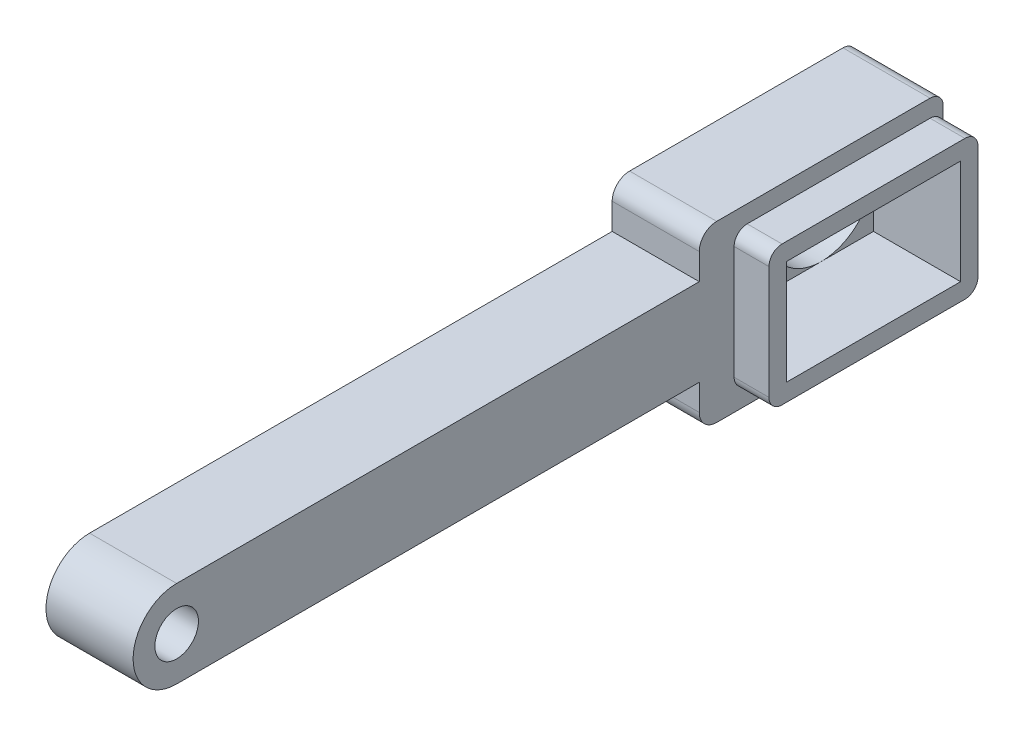
ISO-10303-21;
HEADER;
FILE_DESCRIPTION(('STEP AP214'),'2;1');
FILE_NAME('part.step','',(''),(''),'','','');
FILE_SCHEMA(('AUTOMOTIVE_DESIGN { 1 0 10303 214 1 1 1 1 }'));
ENDSEC;
DATA;
#1=APPLICATION_CONTEXT('core data for automotive mechanical design processes');
#2=APPLICATION_PROTOCOL_DEFINITION('international standard','automotive_design',2000,#1);
#3=PRODUCT_CONTEXT('',#1,'mechanical');
#4=PRODUCT('Part','Part','',(#3));
#5=PRODUCT_RELATED_PRODUCT_CATEGORY('part','',(#4));
#6=PRODUCT_DEFINITION_FORMATION('','',#4);
#7=PRODUCT_DEFINITION_CONTEXT('part definition',#1,'design');
#8=PRODUCT_DEFINITION('design','',#6,#7);
#9=PRODUCT_DEFINITION_SHAPE('','',#8);
#10=(LENGTH_UNIT() NAMED_UNIT(*) SI_UNIT(.MILLI.,.METRE.));
#11=(NAMED_UNIT(*) PLANE_ANGLE_UNIT() SI_UNIT($,.RADIAN.));
#12=(NAMED_UNIT(*) SI_UNIT($,.STERADIAN.) SOLID_ANGLE_UNIT());
#13=UNCERTAINTY_MEASURE_WITH_UNIT(LENGTH_MEASURE(1.E-05),#10,'distance_accuracy_value','');
#14=(GEOMETRIC_REPRESENTATION_CONTEXT(3) GLOBAL_UNCERTAINTY_ASSIGNED_CONTEXT((#13)) GLOBAL_UNIT_ASSIGNED_CONTEXT((#10,
#11,#12)) REPRESENTATION_CONTEXT('',''));
#15=CARTESIAN_POINT('',(0.,0.,0.));
#16=DIRECTION('',(0.,0.,1.));
#17=DIRECTION('',(1.,0.,0.));
#18=AXIS2_PLACEMENT_3D('',#15,#16,#17);
#19=CARTESIAN_POINT('',(10.,-8.,-22.));
#20=DIRECTION('',(-1.,0.,0.));
#21=DIRECTION('',(0.,0.,1.));
#22=AXIS2_PLACEMENT_3D('',#19,#20,#21);
#23=PLANE('',#22);
#24=CARTESIAN_POINT('',(10.,6.5,-46.5));
#25=DIRECTION('',(1.,0.,0.));
#26=DIRECTION('',(0.,0.,-1.));
#27=AXIS2_PLACEMENT_3D('',#24,#25,#26);
#28=CIRCLE('',#27,1.5);
#29=CARTESIAN_POINT('',(10.,6.5,-48.));
#30=VERTEX_POINT('',#29);
#31=CARTESIAN_POINT('',(10.,8.,-46.5));
#32=VERTEX_POINT('',#31);
#33=EDGE_CURVE('E279',#30,#32,#28,.T.);
#34=ORIENTED_EDGE('',*,*,#33,.F.);
#35=DIRECTION('',(0.,1.,0.));
#36=VECTOR('',#35,1.);
#37=CARTESIAN_POINT('',(10.,8.49999999999999,-48.));
#38=LINE('',#37,#36);
#39=CARTESIAN_POINT('',(10.,8.49999999999999,-48.));
#40=VERTEX_POINT('',#39);
#41=EDGE_CURVE('E350',#30,#40,#38,.T.);
#42=ORIENTED_EDGE('',*,*,#41,.T.);
#43=CARTESIAN_POINT('',(10.,8.49999999999999,-46.5));
#44=DIRECTION('',(1.,0.,0.));
#45=DIRECTION('',(0.,0.,1.));
#46=AXIS2_PLACEMENT_3D('',#43,#44,#45);
#47=CIRCLE('',#46,1.5);
#48=CARTESIAN_POINT('',(10.,10.,-46.5));
#49=VERTEX_POINT('',#48);
#50=EDGE_CURVE('E353',#40,#49,#47,.T.);
#51=ORIENTED_EDGE('',*,*,#50,.T.);
#52=DIRECTION('',(0.,0.,1.));
#53=VECTOR('',#52,1.);
#54=CARTESIAN_POINT('',(10.,10.,-40.));
#55=LINE('',#54,#53);
#56=CARTESIAN_POINT('',(10.,10.,-22.));
#57=VERTEX_POINT('',#56);
#58=EDGE_CURVE('E355',#49,#57,#55,.T.);
#59=ORIENTED_EDGE('',*,*,#58,.T.);
#60=CARTESIAN_POINT('',(10.,8.,-22.));
#61=DIRECTION('',(1.,0.,0.));
#62=DIRECTION('',(0.,0.,1.));
#63=AXIS2_PLACEMENT_3D('',#60,#61,#62);
#64=CIRCLE('',#63,2.);
#65=CARTESIAN_POINT('',(10.,8.,-20.));
#66=VERTEX_POINT('',#65);
#67=EDGE_CURVE('E357',#57,#66,#64,.T.);
#68=ORIENTED_EDGE('',*,*,#67,.T.);
#69=DIRECTION('',(0.,-1.,0.));
#70=VECTOR('',#69,1.);
#71=CARTESIAN_POINT('',(10.,5.,-20.));
#72=LINE('',#71,#70);
#73=CARTESIAN_POINT('',(10.,5.,-20.));
#74=VERTEX_POINT('',#73);
#75=EDGE_CURVE('E359',#66,#74,#72,.T.);
#76=ORIENTED_EDGE('',*,*,#75,.T.);
#77=DIRECTION('',(0.,0.,1.));
#78=VECTOR('',#77,1.);
#79=CARTESIAN_POINT('',(10.,5.,0.));
#80=LINE('',#79,#78);
#81=CARTESIAN_POINT('',(10.,4.99999999999999,40.));
#82=VERTEX_POINT('',#81);
#83=EDGE_CURVE('E361',#74,#82,#80,.T.);
#84=ORIENTED_EDGE('',*,*,#83,.T.);
#85=CARTESIAN_POINT('',(10.,0.,40.));
#86=DIRECTION('',(1.,0.,0.));
#87=DIRECTION('',(0.,0.,-1.));
#88=AXIS2_PLACEMENT_3D('',#85,#86,#87);
#89=CIRCLE('',#88,4.99999999999999);
#90=CARTESIAN_POINT('',(10.,-4.99999999999999,40.));
#91=VERTEX_POINT('',#90);
#92=EDGE_CURVE('E363',#82,#91,#89,.T.);
#93=ORIENTED_EDGE('',*,*,#92,.T.);
#94=DIRECTION('',(0.,0.,-1.));
#95=VECTOR('',#94,1.);
#96=CARTESIAN_POINT('',(10.,-5.,0.));
#97=LINE('',#96,#95);
#98=CARTESIAN_POINT('',(10.,-5.,-20.));
#99=VERTEX_POINT('',#98);
#100=EDGE_CURVE('E365',#91,#99,#97,.T.);
#101=ORIENTED_EDGE('',*,*,#100,.T.);
#102=DIRECTION('',(0.,-1.,0.));
#103=VECTOR('',#102,1.);
#104=CARTESIAN_POINT('',(10.,-5.,-20.));
#105=LINE('',#104,#103);
#106=CARTESIAN_POINT('',(10.,-8.,-20.));
#107=VERTEX_POINT('',#106);
#108=EDGE_CURVE('E367',#99,#107,#105,.T.);
#109=ORIENTED_EDGE('',*,*,#108,.T.);
#110=CARTESIAN_POINT('',(10.,-8.,-22.));
#111=DIRECTION('',(1.,0.,0.));
#112=DIRECTION('',(0.,0.,1.));
#113=AXIS2_PLACEMENT_3D('',#110,#111,#112);
#114=CIRCLE('',#113,2.);
#115=CARTESIAN_POINT('',(10.,-10.,-22.));
#116=VERTEX_POINT('',#115);
#117=EDGE_CURVE('E369',#107,#116,#114,.T.);
#118=ORIENTED_EDGE('',*,*,#117,.T.);
#119=DIRECTION('',(0.,0.,-1.));
#120=VECTOR('',#119,1.);
#121=CARTESIAN_POINT('',(10.,-10.,-46.5));
#122=LINE('',#121,#120);
#123=CARTESIAN_POINT('',(10.,-10.,-46.5));
#124=VERTEX_POINT('',#123);
#125=EDGE_CURVE('E344',#116,#124,#122,.T.);
#126=ORIENTED_EDGE('',*,*,#125,.T.);
#127=CARTESIAN_POINT('',(10.,-8.49999999999999,-46.5));
#128=DIRECTION('',(1.,0.,0.));
#129=DIRECTION('',(0.,0.,1.));
#130=AXIS2_PLACEMENT_3D('',#127,#128,#129);
#131=CIRCLE('',#130,1.5);
#132=CARTESIAN_POINT('',(10.,-8.49999999999999,-48.));
#133=VERTEX_POINT('',#132);
#134=EDGE_CURVE('E347',#124,#133,#131,.T.);
#135=ORIENTED_EDGE('',*,*,#134,.T.);
#136=CARTESIAN_POINT('',(10.,-6.5,-48.));
#137=VERTEX_POINT('',#136);
#138=EDGE_CURVE('E351',#133,#137,#38,.T.);
#139=ORIENTED_EDGE('',*,*,#138,.T.);
#140=CARTESIAN_POINT('',(10.,-6.5,-46.5));
#141=DIRECTION('',(1.,0.,0.));
#142=DIRECTION('',(0.,0.,-1.));
#143=AXIS2_PLACEMENT_3D('',#140,#141,#142);
#144=CIRCLE('',#143,1.5);
#145=CARTESIAN_POINT('',(10.,-8.,-46.5));
#146=VERTEX_POINT('',#145);
#147=EDGE_CURVE('E276',#146,#137,#144,.T.);
#148=ORIENTED_EDGE('',*,*,#147,.F.);
#149=DIRECTION('',(0.,0.,-1.));
#150=VECTOR('',#149,1.);
#151=CARTESIAN_POINT('',(10.,-8.,0.));
#152=LINE('',#151,#150);
#153=CARTESIAN_POINT('',(10.,-8.,-25.5));
#154=VERTEX_POINT('',#153);
#155=EDGE_CURVE('E273',#154,#146,#152,.T.);
#156=ORIENTED_EDGE('',*,*,#155,.F.);
#157=CARTESIAN_POINT('',(10.,-6.5,-25.5));
#158=DIRECTION('',(1.,0.,0.));
#159=DIRECTION('',(0.,0.,-1.));
#160=AXIS2_PLACEMENT_3D('',#157,#158,#159);
#161=CIRCLE('',#160,1.5);
#162=CARTESIAN_POINT('',(10.,-6.49999999999999,-24.));
#163=VERTEX_POINT('',#162);
#164=EDGE_CURVE('E270',#163,#154,#161,.T.);
#165=ORIENTED_EDGE('',*,*,#164,.F.);
#166=DIRECTION('',(0.,-1.,0.));
#167=VECTOR('',#166,1.);
#168=CARTESIAN_POINT('',(10.,0.,-24.));
#169=LINE('',#168,#167);
#170=CARTESIAN_POINT('',(10.,6.49999999999999,-24.));
#171=VERTEX_POINT('',#170);
#172=EDGE_CURVE('E267',#171,#163,#169,.T.);
#173=ORIENTED_EDGE('',*,*,#172,.F.);
#174=CARTESIAN_POINT('',(10.,6.5,-25.5));
#175=DIRECTION('',(1.,0.,0.));
#176=DIRECTION('',(0.,0.,-1.));
#177=AXIS2_PLACEMENT_3D('',#174,#175,#176);
#178=CIRCLE('',#177,1.5);
#179=CARTESIAN_POINT('',(10.,8.,-25.5));
#180=VERTEX_POINT('',#179);
#181=EDGE_CURVE('E56',#180,#171,#178,.T.);
#182=ORIENTED_EDGE('',*,*,#181,.F.);
#183=DIRECTION('',(0.,0.,1.));
#184=VECTOR('',#183,1.);
#185=CARTESIAN_POINT('',(10.,8.,0.));
#186=LINE('',#185,#184);
#187=EDGE_CURVE('E51',#32,#180,#186,.T.);
#188=ORIENTED_EDGE('',*,*,#187,.F.);
#189=EDGE_LOOP('',(#34,#42,#51,#59,#68,#76,#84,#93,#101,#109,#118,#126,#135,#139,#148,#156,#165,
#173,#182,#188));
#190=FACE_BOUND('',#189,.T.);
#191=CARTESIAN_POINT('',(10.,0.,40.));
#192=DIRECTION('',(1.,0.,0.));
#193=DIRECTION('',(0.,0.,-1.));
#194=AXIS2_PLACEMENT_3D('',#191,#192,#193);
#195=CIRCLE('',#194,2.5);
#196=CARTESIAN_POINT('',(10.,0.,37.5));
#197=VERTEX_POINT('',#196);
#198=EDGE_CURVE('E337',#197,#197,#195,.T.);
#199=ORIENTED_EDGE('',*,*,#198,.F.);
#200=EDGE_LOOP('',(#199));
#201=FACE_BOUND('',#200,.T.);
#202=ADVANCED_FACE('F36',(#190,#201),#23,.F.);
#203=CARTESIAN_POINT('',(0.,-8.,-22.));
#204=DIRECTION('',(-1.,0.,0.));
#205=DIRECTION('',(0.,0.,1.));
#206=AXIS2_PLACEMENT_3D('',#203,#204,#205);
#207=PLANE('',#206);
#208=CARTESIAN_POINT('',(0.,-8.49999999999999,-46.5));
#209=DIRECTION('',(1.,0.,0.));
#210=DIRECTION('',(0.,0.,1.));
#211=AXIS2_PLACEMENT_3D('',#208,#209,#210);
#212=CIRCLE('',#211,1.5);
#213=CARTESIAN_POINT('',(0.,-10.,-46.5));
#214=VERTEX_POINT('',#213);
#215=CARTESIAN_POINT('',(0.,-8.49999999999999,-48.));
#216=VERTEX_POINT('',#215);
#217=EDGE_CURVE('E341',#214,#216,#212,.T.);
#218=ORIENTED_EDGE('',*,*,#217,.F.);
#219=DIRECTION('',(0.,0.,-1.));
#220=VECTOR('',#219,1.);
#221=CARTESIAN_POINT('',(0.,-10.,-22.));
#222=LINE('',#221,#220);
#223=CARTESIAN_POINT('',(0.,-10.,-22.));
#224=VERTEX_POINT('',#223);
#225=EDGE_CURVE('E348',#224,#214,#222,.T.);
#226=ORIENTED_EDGE('',*,*,#225,.F.);
#227=CARTESIAN_POINT('',(0.,-8.,-22.));
#228=DIRECTION('',(1.,0.,0.));
#229=DIRECTION('',(0.,0.,1.));
#230=AXIS2_PLACEMENT_3D('',#227,#228,#229);
#231=CIRCLE('',#230,2.);
#232=CARTESIAN_POINT('',(0.,-8.,-20.));
#233=VERTEX_POINT('',#232);
#234=EDGE_CURVE('E395',#233,#224,#231,.T.);
#235=ORIENTED_EDGE('',*,*,#234,.F.);
#236=DIRECTION('',(0.,-1.,0.));
#237=VECTOR('',#236,1.);
#238=CARTESIAN_POINT('',(0.,-5.,-20.));
#239=LINE('',#238,#237);
#240=CARTESIAN_POINT('',(0.,-5.,-20.));
#241=VERTEX_POINT('',#240);
#242=EDGE_CURVE('E393',#241,#233,#239,.T.);
#243=ORIENTED_EDGE('',*,*,#242,.F.);
#244=DIRECTION('',(0.,0.,-1.));
#245=VECTOR('',#244,1.);
#246=CARTESIAN_POINT('',(0.,-5.,0.));
#247=LINE('',#246,#245);
#248=CARTESIAN_POINT('',(0.,-4.99999999999999,40.));
#249=VERTEX_POINT('',#248);
#250=EDGE_CURVE('E391',#249,#241,#247,.T.);
#251=ORIENTED_EDGE('',*,*,#250,.F.);
#252=CARTESIAN_POINT('',(0.,0.,40.));
#253=DIRECTION('',(1.,0.,0.));
#254=DIRECTION('',(0.,0.,-1.));
#255=AXIS2_PLACEMENT_3D('',#252,#253,#254);
#256=CIRCLE('',#255,4.99999999999999);
#257=CARTESIAN_POINT('',(0.,4.99999999999999,40.));
#258=VERTEX_POINT('',#257);
#259=EDGE_CURVE('E388',#258,#249,#256,.T.);
#260=ORIENTED_EDGE('',*,*,#259,.F.);
#261=DIRECTION('',(0.,0.,1.));
#262=VECTOR('',#261,1.);
#263=CARTESIAN_POINT('',(0.,5.,0.));
#264=LINE('',#263,#262);
#265=CARTESIAN_POINT('',(0.,5.,-20.));
#266=VERTEX_POINT('',#265);
#267=EDGE_CURVE('E386',#266,#258,#264,.T.);
#268=ORIENTED_EDGE('',*,*,#267,.F.);
#269=DIRECTION('',(0.,-1.,0.));
#270=VECTOR('',#269,1.);
#271=CARTESIAN_POINT('',(0.,5.,-20.));
#272=LINE('',#271,#270);
#273=CARTESIAN_POINT('',(0.,8.,-20.));
#274=VERTEX_POINT('',#273);
#275=EDGE_CURVE('E383',#274,#266,#272,.T.);
#276=ORIENTED_EDGE('',*,*,#275,.F.);
#277=CARTESIAN_POINT('',(0.,8.,-22.));
#278=DIRECTION('',(1.,0.,0.));
#279=DIRECTION('',(0.,0.,1.));
#280=AXIS2_PLACEMENT_3D('',#277,#278,#279);
#281=CIRCLE('',#280,2.);
#282=CARTESIAN_POINT('',(0.,10.,-22.));
#283=VERTEX_POINT('',#282);
#284=EDGE_CURVE('E381',#283,#274,#281,.T.);
#285=ORIENTED_EDGE('',*,*,#284,.F.);
#286=DIRECTION('',(0.,0.,1.));
#287=VECTOR('',#286,1.);
#288=CARTESIAN_POINT('',(0.,10.,-22.));
#289=LINE('',#288,#287);
#290=CARTESIAN_POINT('',(0.,10.,-46.5));
#291=VERTEX_POINT('',#290);
#292=EDGE_CURVE('E379',#291,#283,#289,.T.);
#293=ORIENTED_EDGE('',*,*,#292,.F.);
#294=CARTESIAN_POINT('',(0.,8.49999999999999,-46.5));
#295=DIRECTION('',(1.,0.,0.));
#296=DIRECTION('',(0.,0.,1.));
#297=AXIS2_PLACEMENT_3D('',#294,#295,#296);
#298=CIRCLE('',#297,1.5);
#299=CARTESIAN_POINT('',(0.,8.49999999999999,-48.));
#300=VERTEX_POINT('',#299);
#301=EDGE_CURVE('E376',#300,#291,#298,.T.);
#302=ORIENTED_EDGE('',*,*,#301,.F.);
#303=DIRECTION('',(0.,1.,0.));
#304=VECTOR('',#303,1.);
#305=CARTESIAN_POINT('',(0.,8.49999999999999,-48.));
#306=LINE('',#305,#304);
#307=EDGE_CURVE('E374',#216,#300,#306,.T.);
#308=ORIENTED_EDGE('',*,*,#307,.F.);
#309=EDGE_LOOP('',(#218,#226,#235,#243,#251,#260,#268,#276,#285,#293,#302,#308));
#310=FACE_BOUND('',#309,.T.);
#311=CARTESIAN_POINT('',(0.,0.,-34.));
#312=DIRECTION('',(1.,0.,0.));
#313=DIRECTION('',(0.,0.,-1.));
#314=AXIS2_PLACEMENT_3D('',#311,#312,#313);
#315=CIRCLE('',#314,4.);
#316=CARTESIAN_POINT('',(0.,3.77123616632825,-35.3333333333333));
#317=VERTEX_POINT('',#316);
#318=CARTESIAN_POINT('',(0.,-3.77123616632825,-35.3333333333333));
#319=VERTEX_POINT('',#318);
#320=EDGE_CURVE('E328',#317,#319,#315,.T.);
#321=ORIENTED_EDGE('',*,*,#320,.T.);
#322=CARTESIAN_POINT('',(0.,0.,-40.));
#323=DIRECTION('',(-1.,0.,0.));
#324=DIRECTION('',(0.,0.,1.));
#325=AXIS2_PLACEMENT_3D('',#322,#323,#324);
#326=CIRCLE('',#325,6.);
#327=EDGE_CURVE('E325',#317,#319,#326,.T.);
#328=ORIENTED_EDGE('',*,*,#327,.F.);
#329=EDGE_LOOP('',(#321,#328));
#330=FACE_BOUND('',#329,.T.);
#331=ADVANCED_FACE('F441',(#310,#330),#207,.T.);
#332=CARTESIAN_POINT('',(10.,-8.49999999999999,-46.5));
#333=DIRECTION('',(-1.,0.,0.));
#334=DIRECTION('',(0.,0.,1.));
#335=AXIS2_PLACEMENT_3D('',#332,#333,#334);
#336=CYLINDRICAL_SURFACE('',#335,1.5);
#337=ORIENTED_EDGE('',*,*,#217,.T.);
#338=DIRECTION('',(-1.,0.,0.));
#339=VECTOR('',#338,1.);
#340=CARTESIAN_POINT('',(10.,-8.49999999999999,-48.));
#341=LINE('',#340,#339);
#342=EDGE_CURVE('E427',#133,#216,#341,.T.);
#343=ORIENTED_EDGE('',*,*,#342,.F.);
#344=ORIENTED_EDGE('',*,*,#134,.F.);
#345=DIRECTION('',(-1.,0.,0.));
#346=VECTOR('',#345,1.);
#347=CARTESIAN_POINT('',(10.,-10.,-46.5));
#348=LINE('',#347,#346);
#349=EDGE_CURVE('E44',#124,#214,#348,.T.);
#350=ORIENTED_EDGE('',*,*,#349,.T.);
#351=EDGE_LOOP('',(#337,#343,#344,#350));
#352=FACE_BOUND('',#351,.T.);
#353=ADVANCED_FACE('F38',(#352),#336,.T.);
#354=CARTESIAN_POINT('',(10.,8.49999999999999,-48.));
#355=DIRECTION('',(0.,0.,1.));
#356=DIRECTION('',(1.,0.,0.));
#357=AXIS2_PLACEMENT_3D('',#354,#355,#356);
#358=PLANE('',#357);
#359=ORIENTED_EDGE('',*,*,#307,.T.);
#360=DIRECTION('',(-1.,0.,0.));
#361=VECTOR('',#360,1.);
#362=CARTESIAN_POINT('',(10.,8.49999999999999,-48.));
#363=LINE('',#362,#361);
#364=EDGE_CURVE('E424',#40,#300,#363,.T.);
#365=ORIENTED_EDGE('',*,*,#364,.F.);
#366=ORIENTED_EDGE('',*,*,#41,.F.);
#367=DIRECTION('',(-1.,0.,0.));
#368=VECTOR('',#367,1.);
#369=CARTESIAN_POINT('',(14.,6.49999999999999,-48.));
#370=LINE('',#369,#368);
#371=CARTESIAN_POINT('',(14.,6.49999999999999,-48.));
#372=VERTEX_POINT('',#371);
#373=EDGE_CURVE('E290',#372,#30,#370,.T.);
#374=ORIENTED_EDGE('',*,*,#373,.F.);
#375=DIRECTION('',(0.,1.,0.));
#376=VECTOR('',#375,1.);
#377=CARTESIAN_POINT('',(14.,0.,-48.));
#378=LINE('',#377,#376);
#379=CARTESIAN_POINT('',(14.,-6.49999999999999,-48.));
#380=VERTEX_POINT('',#379);
#381=EDGE_CURVE('E258',#380,#372,#378,.T.);
#382=ORIENTED_EDGE('',*,*,#381,.F.);
#383=DIRECTION('',(-1.,0.,0.));
#384=VECTOR('',#383,1.);
#385=CARTESIAN_POINT('',(14.,-6.49999999999999,-48.));
#386=LINE('',#385,#384);
#387=EDGE_CURVE('E293',#380,#137,#386,.T.);
#388=ORIENTED_EDGE('',*,*,#387,.T.);
#389=ORIENTED_EDGE('',*,*,#138,.F.);
#390=ORIENTED_EDGE('',*,*,#342,.T.);
#391=EDGE_LOOP('',(#359,#365,#366,#374,#382,#388,#389,#390));
#392=FACE_BOUND('',#391,.T.);
#393=ADVANCED_FACE('F446',(#392),#358,.F.);
#394=CARTESIAN_POINT('',(10.,8.49999999999999,-46.5));
#395=DIRECTION('',(-1.,0.,0.));
#396=DIRECTION('',(0.,0.,1.));
#397=AXIS2_PLACEMENT_3D('',#394,#395,#396);
#398=CYLINDRICAL_SURFACE('',#397,1.5);
#399=ORIENTED_EDGE('',*,*,#301,.T.);
#400=DIRECTION('',(-1.,0.,0.));
#401=VECTOR('',#400,1.);
#402=CARTESIAN_POINT('',(10.,10.,-46.5));
#403=LINE('',#402,#401);
#404=EDGE_CURVE('E421',#49,#291,#403,.T.);
#405=ORIENTED_EDGE('',*,*,#404,.F.);
#406=ORIENTED_EDGE('',*,*,#50,.F.);
#407=ORIENTED_EDGE('',*,*,#364,.T.);
#408=EDGE_LOOP('',(#399,#405,#406,#407));
#409=FACE_BOUND('',#408,.T.);
#410=ADVANCED_FACE('F451',(#409),#398,.T.);
#411=CARTESIAN_POINT('',(10.,10.,-22.));
#412=DIRECTION('',(0.,-1.,0.));
#413=DIRECTION('',(0.,0.,-1.));
#414=AXIS2_PLACEMENT_3D('',#411,#412,#413);
#415=PLANE('',#414);
#416=ORIENTED_EDGE('',*,*,#292,.T.);
#417=DIRECTION('',(-1.,0.,0.));
#418=VECTOR('',#417,1.);
#419=CARTESIAN_POINT('',(10.,10.,-22.));
#420=LINE('',#419,#418);
#421=EDGE_CURVE('E418',#57,#283,#420,.T.);
#422=ORIENTED_EDGE('',*,*,#421,.F.);
#423=ORIENTED_EDGE('',*,*,#58,.F.);
#424=ORIENTED_EDGE('',*,*,#404,.T.);
#425=EDGE_LOOP('',(#416,#422,#423,#424));
#426=FACE_BOUND('',#425,.T.);
#427=ADVANCED_FACE('F534',(#426),#415,.F.);
#428=CARTESIAN_POINT('',(10.,8.,-22.));
#429=DIRECTION('',(-1.,0.,0.));
#430=DIRECTION('',(0.,0.,1.));
#431=AXIS2_PLACEMENT_3D('',#428,#429,#430);
#432=CYLINDRICAL_SURFACE('',#431,2.);
#433=ORIENTED_EDGE('',*,*,#284,.T.);
#434=DIRECTION('',(-1.,0.,0.));
#435=VECTOR('',#434,1.);
#436=CARTESIAN_POINT('',(10.,8.,-20.));
#437=LINE('',#436,#435);
#438=EDGE_CURVE('E415',#66,#274,#437,.T.);
#439=ORIENTED_EDGE('',*,*,#438,.F.);
#440=ORIENTED_EDGE('',*,*,#67,.F.);
#441=ORIENTED_EDGE('',*,*,#421,.T.);
#442=EDGE_LOOP('',(#433,#439,#440,#441));
#443=FACE_BOUND('',#442,.T.);
#444=ADVANCED_FACE('F530',(#443),#432,.T.);
#445=CARTESIAN_POINT('',(10.,5.,-20.));
#446=DIRECTION('',(0.,0.,-1.));
#447=DIRECTION('',(-1.,0.,0.));
#448=AXIS2_PLACEMENT_3D('',#445,#446,#447);
#449=PLANE('',#448);
#450=ORIENTED_EDGE('',*,*,#275,.T.);
#451=DIRECTION('',(-1.,0.,0.));
#452=VECTOR('',#451,1.);
#453=CARTESIAN_POINT('',(10.,5.,-20.));
#454=LINE('',#453,#452);
#455=EDGE_CURVE('E412',#74,#266,#454,.T.);
#456=ORIENTED_EDGE('',*,*,#455,.F.);
#457=ORIENTED_EDGE('',*,*,#75,.F.);
#458=ORIENTED_EDGE('',*,*,#438,.T.);
#459=EDGE_LOOP('',(#450,#456,#457,#458));
#460=FACE_BOUND('',#459,.T.);
#461=ADVANCED_FACE('F526',(#460),#449,.F.);
#462=CARTESIAN_POINT('',(10.,5.,0.));
#463=DIRECTION('',(0.,-1.,0.));
#464=DIRECTION('',(0.,0.,-1.));
#465=AXIS2_PLACEMENT_3D('',#462,#463,#464);
#466=PLANE('',#465);
#467=ORIENTED_EDGE('',*,*,#267,.T.);
#468=DIRECTION('',(-1.,0.,0.));
#469=VECTOR('',#468,1.);
#470=CARTESIAN_POINT('',(10.,4.99999999999999,40.));
#471=LINE('',#470,#469);
#472=EDGE_CURVE('E409',#82,#258,#471,.T.);
#473=ORIENTED_EDGE('',*,*,#472,.F.);
#474=ORIENTED_EDGE('',*,*,#83,.F.);
#475=ORIENTED_EDGE('',*,*,#455,.T.);
#476=EDGE_LOOP('',(#467,#473,#474,#475));
#477=FACE_BOUND('',#476,.T.);
#478=ADVANCED_FACE('F522',(#477),#466,.F.);
#479=CARTESIAN_POINT('',(10.,0.,40.));
#480=DIRECTION('',(-1.,0.,0.));
#481=DIRECTION('',(0.,0.,1.));
#482=AXIS2_PLACEMENT_3D('',#479,#480,#481);
#483=CYLINDRICAL_SURFACE('',#482,4.99999999999999);
#484=ORIENTED_EDGE('',*,*,#259,.T.);
#485=DIRECTION('',(-1.,0.,0.));
#486=VECTOR('',#485,1.);
#487=CARTESIAN_POINT('',(10.,-4.99999999999999,40.));
#488=LINE('',#487,#486);
#489=EDGE_CURVE('E406',#91,#249,#488,.T.);
#490=ORIENTED_EDGE('',*,*,#489,.F.);
#491=ORIENTED_EDGE('',*,*,#92,.F.);
#492=ORIENTED_EDGE('',*,*,#472,.T.);
#493=EDGE_LOOP('',(#484,#490,#491,#492));
#494=FACE_BOUND('',#493,.T.);
#495=ADVANCED_FACE('F518',(#494),#483,.T.);
#496=CARTESIAN_POINT('',(10.,-5.,0.));
#497=DIRECTION('',(0.,1.,0.));
#498=DIRECTION('',(0.,0.,1.));
#499=AXIS2_PLACEMENT_3D('',#496,#497,#498);
#500=PLANE('',#499);
#501=ORIENTED_EDGE('',*,*,#250,.T.);
#502=DIRECTION('',(-1.,0.,0.));
#503=VECTOR('',#502,1.);
#504=CARTESIAN_POINT('',(10.,-5.,-20.));
#505=LINE('',#504,#503);
#506=EDGE_CURVE('E403',#99,#241,#505,.T.);
#507=ORIENTED_EDGE('',*,*,#506,.F.);
#508=ORIENTED_EDGE('',*,*,#100,.F.);
#509=ORIENTED_EDGE('',*,*,#489,.T.);
#510=EDGE_LOOP('',(#501,#507,#508,#509));
#511=FACE_BOUND('',#510,.T.);
#512=ADVANCED_FACE('F514',(#511),#500,.F.);
#513=CARTESIAN_POINT('',(10.,-5.,-20.));
#514=DIRECTION('',(0.,0.,-1.));
#515=DIRECTION('',(-1.,0.,0.));
#516=AXIS2_PLACEMENT_3D('',#513,#514,#515);
#517=PLANE('',#516);
#518=ORIENTED_EDGE('',*,*,#242,.T.);
#519=DIRECTION('',(-1.,0.,0.));
#520=VECTOR('',#519,1.);
#521=CARTESIAN_POINT('',(10.,-8.,-20.));
#522=LINE('',#521,#520);
#523=EDGE_CURVE('E400',#107,#233,#522,.T.);
#524=ORIENTED_EDGE('',*,*,#523,.F.);
#525=ORIENTED_EDGE('',*,*,#108,.F.);
#526=ORIENTED_EDGE('',*,*,#506,.T.);
#527=EDGE_LOOP('',(#518,#524,#525,#526));
#528=FACE_BOUND('',#527,.T.);
#529=ADVANCED_FACE('F510',(#528),#517,.F.);
#530=CARTESIAN_POINT('',(10.,-8.,-22.));
#531=DIRECTION('',(-1.,0.,0.));
#532=DIRECTION('',(0.,0.,1.));
#533=AXIS2_PLACEMENT_3D('',#530,#531,#532);
#534=CYLINDRICAL_SURFACE('',#533,2.);
#535=ORIENTED_EDGE('',*,*,#234,.T.);
#536=DIRECTION('',(-1.,0.,0.));
#537=VECTOR('',#536,1.);
#538=CARTESIAN_POINT('',(10.,-10.,-22.));
#539=LINE('',#538,#537);
#540=EDGE_CURVE('E372',#116,#224,#539,.T.);
#541=ORIENTED_EDGE('',*,*,#540,.F.);
#542=ORIENTED_EDGE('',*,*,#117,.F.);
#543=ORIENTED_EDGE('',*,*,#523,.T.);
#544=EDGE_LOOP('',(#535,#541,#542,#543));
#545=FACE_BOUND('',#544,.T.);
#546=ADVANCED_FACE('F507',(#545),#534,.T.);
#547=CARTESIAN_POINT('',(10.,-10.,-22.));
#548=DIRECTION('',(0.,1.,0.));
#549=DIRECTION('',(0.,0.,1.));
#550=AXIS2_PLACEMENT_3D('',#547,#548,#549);
#551=PLANE('',#550);
#552=ORIENTED_EDGE('',*,*,#225,.T.);
#553=ORIENTED_EDGE('',*,*,#349,.F.);
#554=ORIENTED_EDGE('',*,*,#125,.F.);
#555=ORIENTED_EDGE('',*,*,#540,.T.);
#556=EDGE_LOOP('',(#552,#553,#554,#555));
#557=FACE_BOUND('',#556,.T.);
#558=ADVANCED_FACE('F435',(#557),#551,.F.);
#559=CARTESIAN_POINT('',(5.,0.,40.));
#560=DIRECTION('',(1.,0.,0.));
#561=DIRECTION('',(0.,0.,-1.));
#562=AXIS2_PLACEMENT_3D('',#559,#560,#561);
#563=CYLINDRICAL_SURFACE('',#562,2.5);
#564=CARTESIAN_POINT('',(5.,0.,40.));
#565=DIRECTION('',(1.,0.,0.));
#566=DIRECTION('',(0.,0.,-1.));
#567=AXIS2_PLACEMENT_3D('',#564,#565,#566);
#568=CIRCLE('',#567,2.5);
#569=CARTESIAN_POINT('',(5.,0.,37.5));
#570=VERTEX_POINT('',#569);
#571=EDGE_CURVE('E338',#570,#570,#568,.T.);
#572=ORIENTED_EDGE('',*,*,#571,.F.);
#573=EDGE_LOOP('',(#572));
#574=FACE_BOUND('',#573,.T.);
#575=ORIENTED_EDGE('',*,*,#198,.T.);
#576=EDGE_LOOP('',(#575));
#577=FACE_BOUND('',#576,.T.);
#578=ADVANCED_FACE('F502',(#574,#577),#563,.F.);
#579=CARTESIAN_POINT('',(5.,0.,40.));
#580=DIRECTION('',(1.,0.,0.));
#581=DIRECTION('',(0.,0.,-1.));
#582=AXIS2_PLACEMENT_3D('',#579,#580,#581);
#583=PLANE('',#582);
#584=ORIENTED_EDGE('',*,*,#571,.T.);
#585=EDGE_LOOP('',(#584));
#586=FACE_BOUND('',#585,.T.);
#587=ADVANCED_FACE('F559',(#586),#583,.T.);
#588=CARTESIAN_POINT('',(0.,0.,-40.));
#589=DIRECTION('',(1.,0.,0.));
#590=DIRECTION('',(0.,0.,-1.));
#591=AXIS2_PLACEMENT_3D('',#588,#589,#590);
#592=CYLINDRICAL_SURFACE('',#591,6.);
#593=CARTESIAN_POINT('',(4.,0.,-40.));
#594=DIRECTION('',(-1.,0.,0.));
#595=DIRECTION('',(0.,0.,1.));
#596=AXIS2_PLACEMENT_3D('',#593,#594,#595);
#597=CIRCLE('',#596,6.);
#598=CARTESIAN_POINT('',(4.,0.,-46.));
#599=VERTEX_POINT('',#598);
#600=CARTESIAN_POINT('',(4.,-6.,-40.));
#601=VERTEX_POINT('',#600);
#602=EDGE_CURVE('E825',#599,#601,#597,.T.);
#603=ORIENTED_EDGE('',*,*,#602,.F.);
#604=CARTESIAN_POINT('',(4.,6.,-40.));
#605=VERTEX_POINT('',#604);
#606=EDGE_CURVE('E324',#605,#599,#597,.T.);
#607=ORIENTED_EDGE('',*,*,#606,.F.);
#608=CARTESIAN_POINT('',(4.,3.77123616632825,-35.3333333333333));
#609=VERTEX_POINT('',#608);
#610=EDGE_CURVE('E227',#609,#605,#597,.T.);
#611=ORIENTED_EDGE('',*,*,#610,.F.);
#612=DIRECTION('',(1.,0.,0.));
#613=VECTOR('',#612,1.);
#614=CARTESIAN_POINT('',(0.,3.77123616632825,-35.3333333333333));
#615=LINE('',#614,#613);
#616=EDGE_CURVE('E331',#317,#609,#615,.T.);
#617=ORIENTED_EDGE('',*,*,#616,.F.);
#618=ORIENTED_EDGE('',*,*,#327,.T.);
#619=DIRECTION('',(1.,0.,0.));
#620=VECTOR('',#619,1.);
#621=CARTESIAN_POINT('',(0.,-3.77123616632825,-35.3333333333333));
#622=LINE('',#621,#620);
#623=CARTESIAN_POINT('',(4.,-3.77123616632825,-35.3333333333333));
#624=VERTEX_POINT('',#623);
#625=EDGE_CURVE('E334',#319,#624,#622,.T.);
#626=ORIENTED_EDGE('',*,*,#625,.T.);
#627=EDGE_CURVE('E323',#601,#624,#597,.T.);
#628=ORIENTED_EDGE('',*,*,#627,.F.);
#629=EDGE_LOOP('',(#603,#607,#611,#617,#618,#626,#628));
#630=FACE_BOUND('',#629,.T.);
#631=ADVANCED_FACE('F563',(#630),#592,.F.);
#632=CARTESIAN_POINT('',(0.,0.,-34.));
#633=DIRECTION('',(1.,0.,0.));
#634=DIRECTION('',(0.,0.,-1.));
#635=AXIS2_PLACEMENT_3D('',#632,#633,#634);
#636=CYLINDRICAL_SURFACE('',#635,4.);
#637=ORIENTED_EDGE('',*,*,#616,.T.);
#638=CARTESIAN_POINT('',(4.,0.,-34.));
#639=DIRECTION('',(-1.,0.,0.));
#640=DIRECTION('',(0.,0.,1.));
#641=AXIS2_PLACEMENT_3D('',#638,#639,#640);
#642=CIRCLE('',#641,4.);
#643=EDGE_CURVE('E11',#609,#624,#642,.F.);
#644=ORIENTED_EDGE('',*,*,#643,.T.);
#645=ORIENTED_EDGE('',*,*,#625,.F.);
#646=ORIENTED_EDGE('',*,*,#320,.F.);
#647=EDGE_LOOP('',(#637,#644,#645,#646));
#648=FACE_BOUND('',#647,.T.);
#649=ADVANCED_FACE('F567',(#648),#636,.F.);
#650=CARTESIAN_POINT('',(4.,-6.,-46.));
#651=DIRECTION('',(0.,1.,0.));
#652=DIRECTION('',(0.,0.,1.));
#653=AXIS2_PLACEMENT_3D('',#650,#651,#652);
#654=PLANE('',#653);
#655=DIRECTION('',(0.,0.,1.));
#656=VECTOR('',#655,1.);
#657=CARTESIAN_POINT('',(4.,-6.,-46.));
#658=LINE('',#657,#656);
#659=CARTESIAN_POINT('',(4.,-6.,-46.));
#660=VERTEX_POINT('',#659);
#661=EDGE_CURVE('E305',#660,#601,#658,.T.);
#662=ORIENTED_EDGE('',*,*,#661,.T.);
#663=CARTESIAN_POINT('',(4.,-6.,-26.));
#664=VERTEX_POINT('',#663);
#665=EDGE_CURVE('E224',#601,#664,#658,.T.);
#666=ORIENTED_EDGE('',*,*,#665,.T.);
#667=DIRECTION('',(1.,0.,0.));
#668=VECTOR('',#667,1.);
#669=CARTESIAN_POINT('',(4.,-6.,-26.));
#670=LINE('',#669,#668);
#671=CARTESIAN_POINT('',(14.,-6.,-26.));
#672=VERTEX_POINT('',#671);
#673=EDGE_CURVE('E216',#664,#672,#670,.T.);
#674=ORIENTED_EDGE('',*,*,#673,.T.);
#675=DIRECTION('',(0.,0.,1.));
#676=VECTOR('',#675,1.);
#677=CARTESIAN_POINT('',(14.,-6.,0.));
#678=LINE('',#677,#676);
#679=CARTESIAN_POINT('',(14.,-6.,-46.));
#680=VERTEX_POINT('',#679);
#681=EDGE_CURVE('E222',#680,#672,#678,.T.);
#682=ORIENTED_EDGE('',*,*,#681,.F.);
#683=DIRECTION('',(1.,0.,0.));
#684=VECTOR('',#683,1.);
#685=CARTESIAN_POINT('',(4.,-6.,-46.));
#686=LINE('',#685,#684);
#687=EDGE_CURVE('E317',#660,#680,#686,.T.);
#688=ORIENTED_EDGE('',*,*,#687,.F.);
#689=EDGE_LOOP('',(#662,#666,#674,#682,#688));
#690=FACE_BOUND('',#689,.T.);
#691=ADVANCED_FACE('F219',(#690),#654,.T.);
#692=CARTESIAN_POINT('',(4.,6.,-26.));
#693=DIRECTION('',(0.,-1.,0.));
#694=DIRECTION('',(0.,0.,-1.));
#695=AXIS2_PLACEMENT_3D('',#692,#693,#694);
#696=PLANE('',#695);
#697=DIRECTION('',(0.,0.,-1.));
#698=VECTOR('',#697,1.);
#699=CARTESIAN_POINT('',(4.,6.,-26.));
#700=LINE('',#699,#698);
#701=CARTESIAN_POINT('',(4.,6.,-26.));
#702=VERTEX_POINT('',#701);
#703=EDGE_CURVE('E310',#702,#605,#700,.T.);
#704=ORIENTED_EDGE('',*,*,#703,.T.);
#705=CARTESIAN_POINT('',(4.,6.,-46.));
#706=VERTEX_POINT('',#705);
#707=EDGE_CURVE('E309',#605,#706,#700,.T.);
#708=ORIENTED_EDGE('',*,*,#707,.T.);
#709=DIRECTION('',(1.,0.,0.));
#710=VECTOR('',#709,1.);
#711=CARTESIAN_POINT('',(4.,6.,-46.));
#712=LINE('',#711,#710);
#713=CARTESIAN_POINT('',(14.,6.,-46.));
#714=VERTEX_POINT('',#713);
#715=EDGE_CURVE('E319',#706,#714,#712,.T.);
#716=ORIENTED_EDGE('',*,*,#715,.T.);
#717=DIRECTION('',(0.,0.,-1.));
#718=VECTOR('',#717,1.);
#719=CARTESIAN_POINT('',(14.,6.,0.));
#720=LINE('',#719,#718);
#721=CARTESIAN_POINT('',(14.,6.,-26.));
#722=VERTEX_POINT('',#721);
#723=EDGE_CURVE('E237',#722,#714,#720,.T.);
#724=ORIENTED_EDGE('',*,*,#723,.F.);
#725=DIRECTION('',(1.,0.,0.));
#726=VECTOR('',#725,1.);
#727=CARTESIAN_POINT('',(4.,6.,-26.));
#728=LINE('',#727,#726);
#729=EDGE_CURVE('E228',#702,#722,#728,.T.);
#730=ORIENTED_EDGE('',*,*,#729,.F.);
#731=EDGE_LOOP('',(#704,#708,#716,#724,#730));
#732=FACE_BOUND('',#731,.T.);
#733=ADVANCED_FACE('F624',(#732),#696,.T.);
#734=CARTESIAN_POINT('',(4.,6.,-46.));
#735=DIRECTION('',(0.,0.,1.));
#736=DIRECTION('',(1.,0.,0.));
#737=AXIS2_PLACEMENT_3D('',#734,#735,#736);
#738=PLANE('',#737);
#739=DIRECTION('',(0.,-1.,0.));
#740=VECTOR('',#739,1.);
#741=CARTESIAN_POINT('',(4.,6.,-46.));
#742=LINE('',#741,#740);
#743=EDGE_CURVE('E314',#706,#599,#742,.T.);
#744=ORIENTED_EDGE('',*,*,#743,.T.);
#745=EDGE_CURVE('E313',#599,#660,#742,.T.);
#746=ORIENTED_EDGE('',*,*,#745,.T.);
#747=ORIENTED_EDGE('',*,*,#687,.T.);
#748=DIRECTION('',(0.,-1.,0.));
#749=VECTOR('',#748,1.);
#750=CARTESIAN_POINT('',(14.,0.,-46.));
#751=LINE('',#750,#749);
#752=EDGE_CURVE('E243',#714,#680,#751,.T.);
#753=ORIENTED_EDGE('',*,*,#752,.F.);
#754=ORIENTED_EDGE('',*,*,#715,.F.);
#755=EDGE_LOOP('',(#744,#746,#747,#753,#754));
#756=FACE_BOUND('',#755,.T.);
#757=ADVANCED_FACE('F588',(#756),#738,.T.);
#758=CARTESIAN_POINT('',(4.,0.,0.));
#759=DIRECTION('',(-1.,0.,0.));
#760=DIRECTION('',(0.,0.,1.));
#761=AXIS2_PLACEMENT_3D('',#758,#759,#760);
#762=PLANE('',#761);
#763=ORIENTED_EDGE('',*,*,#606,.T.);
#764=ORIENTED_EDGE('',*,*,#743,.F.);
#765=ORIENTED_EDGE('',*,*,#707,.F.);
#766=EDGE_LOOP('',(#763,#764,#765));
#767=FACE_BOUND('',#766,.T.);
#768=ADVANCED_FACE('F493',(#767),#762,.F.);
#769=ORIENTED_EDGE('',*,*,#602,.T.);
#770=ORIENTED_EDGE('',*,*,#661,.F.);
#771=ORIENTED_EDGE('',*,*,#745,.F.);
#772=EDGE_LOOP('',(#769,#770,#771));
#773=FACE_BOUND('',#772,.T.);
#774=ADVANCED_FACE('F494',(#773),#762,.F.);
#775=CARTESIAN_POINT('',(4.,-6.,-26.));
#776=DIRECTION('',(0.,0.,-1.));
#777=DIRECTION('',(-1.,0.,0.));
#778=AXIS2_PLACEMENT_3D('',#775,#776,#777);
#779=PLANE('',#778);
#780=ORIENTED_EDGE('',*,*,#729,.T.);
#781=DIRECTION('',(0.,1.,0.));
#782=VECTOR('',#781,1.);
#783=CARTESIAN_POINT('',(14.,0.,-26.));
#784=LINE('',#783,#782);
#785=EDGE_CURVE('E231',#672,#722,#784,.T.);
#786=ORIENTED_EDGE('',*,*,#785,.F.);
#787=ORIENTED_EDGE('',*,*,#673,.F.);
#788=DIRECTION('',(0.,1.,0.));
#789=VECTOR('',#788,1.);
#790=CARTESIAN_POINT('',(4.,-6.,-26.));
#791=LINE('',#790,#789);
#792=EDGE_CURVE('E307',#664,#702,#791,.T.);
#793=ORIENTED_EDGE('',*,*,#792,.T.);
#794=EDGE_LOOP('',(#780,#786,#787,#793));
#795=FACE_BOUND('',#794,.T.);
#796=ADVANCED_FACE('F232',(#795),#779,.T.);
#797=ORIENTED_EDGE('',*,*,#627,.T.);
#798=ORIENTED_EDGE('',*,*,#643,.F.);
#799=ORIENTED_EDGE('',*,*,#610,.T.);
#800=ORIENTED_EDGE('',*,*,#703,.F.);
#801=ORIENTED_EDGE('',*,*,#792,.F.);
#802=ORIENTED_EDGE('',*,*,#665,.F.);
#803=EDGE_LOOP('',(#797,#798,#799,#800,#801,#802));
#804=FACE_BOUND('',#803,.T.);
#805=ADVANCED_FACE('F484',(#804),#762,.F.);
#806=CARTESIAN_POINT('',(14.,0.,-24.));
#807=DIRECTION('',(0.,0.,-1.));
#808=DIRECTION('',(-1.,0.,0.));
#809=AXIS2_PLACEMENT_3D('',#806,#807,#808);
#810=PLANE('',#809);
#811=ORIENTED_EDGE('',*,*,#172,.T.);
#812=DIRECTION('',(-1.,0.,0.));
#813=VECTOR('',#812,1.);
#814=CARTESIAN_POINT('',(14.,-6.49999999999999,-24.));
#815=LINE('',#814,#813);
#816=CARTESIAN_POINT('',(14.,-6.49999999999999,-24.));
#817=VERTEX_POINT('',#816);
#818=EDGE_CURVE('E302',#817,#163,#815,.T.);
#819=ORIENTED_EDGE('',*,*,#818,.F.);
#820=DIRECTION('',(0.,-1.,0.));
#821=VECTOR('',#820,1.);
#822=CARTESIAN_POINT('',(14.,0.,-24.));
#823=LINE('',#822,#821);
#824=CARTESIAN_POINT('',(14.,6.49999999999999,-24.));
#825=VERTEX_POINT('',#824);
#826=EDGE_CURVE('E249',#825,#817,#823,.T.);
#827=ORIENTED_EDGE('',*,*,#826,.F.);
#828=DIRECTION('',(-1.,0.,0.));
#829=VECTOR('',#828,1.);
#830=CARTESIAN_POINT('',(14.,6.49999999999999,-24.));
#831=LINE('',#830,#829);
#832=EDGE_CURVE('E266',#825,#171,#831,.T.);
#833=ORIENTED_EDGE('',*,*,#832,.T.);
#834=EDGE_LOOP('',(#811,#819,#827,#833));
#835=FACE_BOUND('',#834,.T.);
#836=ADVANCED_FACE('F482',(#835),#810,.F.);
#837=CARTESIAN_POINT('',(14.,-6.5,-25.5));
#838=DIRECTION('',(-1.,0.,0.));
#839=DIRECTION('',(0.,0.,1.));
#840=AXIS2_PLACEMENT_3D('',#837,#838,#839);
#841=CYLINDRICAL_SURFACE('',#840,1.5);
#842=ORIENTED_EDGE('',*,*,#164,.T.);
#843=DIRECTION('',(-1.,0.,0.));
#844=VECTOR('',#843,1.);
#845=CARTESIAN_POINT('',(14.,-8.,-25.5));
#846=LINE('',#845,#844);
#847=CARTESIAN_POINT('',(14.,-8.,-25.5));
#848=VERTEX_POINT('',#847);
#849=EDGE_CURVE('E299',#848,#154,#846,.T.);
#850=ORIENTED_EDGE('',*,*,#849,.F.);
#851=CARTESIAN_POINT('',(14.,-6.5,-25.5));
#852=DIRECTION('',(1.,0.,0.));
#853=DIRECTION('',(0.,0.,-1.));
#854=AXIS2_PLACEMENT_3D('',#851,#852,#853);
#855=CIRCLE('',#854,1.5);
#856=EDGE_CURVE('E252',#817,#848,#855,.T.);
#857=ORIENTED_EDGE('',*,*,#856,.F.);
#858=ORIENTED_EDGE('',*,*,#818,.T.);
#859=EDGE_LOOP('',(#842,#850,#857,#858));
#860=FACE_BOUND('',#859,.T.);
#861=ADVANCED_FACE('F474',(#860),#841,.T.);
#862=CARTESIAN_POINT('',(14.,-8.,0.));
#863=DIRECTION('',(0.,1.,0.));
#864=DIRECTION('',(0.,0.,1.));
#865=AXIS2_PLACEMENT_3D('',#862,#863,#864);
#866=PLANE('',#865);
#867=ORIENTED_EDGE('',*,*,#155,.T.);
#868=DIRECTION('',(-1.,0.,0.));
#869=VECTOR('',#868,1.);
#870=CARTESIAN_POINT('',(14.,-8.,-46.5));
#871=LINE('',#870,#869);
#872=CARTESIAN_POINT('',(14.,-8.,-46.5));
#873=VERTEX_POINT('',#872);
#874=EDGE_CURVE('E296',#873,#146,#871,.T.);
#875=ORIENTED_EDGE('',*,*,#874,.F.);
#876=DIRECTION('',(0.,0.,-1.));
#877=VECTOR('',#876,1.);
#878=CARTESIAN_POINT('',(14.,-8.,0.));
#879=LINE('',#878,#877);
#880=EDGE_CURVE('E254',#848,#873,#879,.T.);
#881=ORIENTED_EDGE('',*,*,#880,.F.);
#882=ORIENTED_EDGE('',*,*,#849,.T.);
#883=EDGE_LOOP('',(#867,#875,#881,#882));
#884=FACE_BOUND('',#883,.T.);
#885=ADVANCED_FACE('F470',(#884),#866,.F.);
#886=CARTESIAN_POINT('',(14.,-6.5,-46.5));
#887=DIRECTION('',(-1.,0.,0.));
#888=DIRECTION('',(0.,0.,1.));
#889=AXIS2_PLACEMENT_3D('',#886,#887,#888);
#890=CYLINDRICAL_SURFACE('',#889,1.5);
#891=ORIENTED_EDGE('',*,*,#147,.T.);
#892=ORIENTED_EDGE('',*,*,#387,.F.);
#893=CARTESIAN_POINT('',(14.,-6.5,-46.5));
#894=DIRECTION('',(1.,0.,0.));
#895=DIRECTION('',(0.,0.,-1.));
#896=AXIS2_PLACEMENT_3D('',#893,#894,#895);
#897=CIRCLE('',#896,1.5);
#898=EDGE_CURVE('E256',#873,#380,#897,.T.);
#899=ORIENTED_EDGE('',*,*,#898,.F.);
#900=ORIENTED_EDGE('',*,*,#874,.T.);
#901=EDGE_LOOP('',(#891,#892,#899,#900));
#902=FACE_BOUND('',#901,.T.);
#903=ADVANCED_FACE('F467',(#902),#890,.T.);
#904=CARTESIAN_POINT('',(14.,6.5,-46.5));
#905=DIRECTION('',(-1.,0.,0.));
#906=DIRECTION('',(0.,0.,1.));
#907=AXIS2_PLACEMENT_3D('',#904,#905,#906);
#908=CYLINDRICAL_SURFACE('',#907,1.5);
#909=ORIENTED_EDGE('',*,*,#33,.T.);
#910=DIRECTION('',(-1.,0.,0.));
#911=VECTOR('',#910,1.);
#912=CARTESIAN_POINT('',(14.,8.,-46.5));
#913=LINE('',#912,#911);
#914=CARTESIAN_POINT('',(14.,8.,-46.5));
#915=VERTEX_POINT('',#914);
#916=EDGE_CURVE('E287',#915,#32,#913,.T.);
#917=ORIENTED_EDGE('',*,*,#916,.F.);
#918=CARTESIAN_POINT('',(14.,6.5,-46.5));
#919=DIRECTION('',(1.,0.,0.));
#920=DIRECTION('',(0.,0.,-1.));
#921=AXIS2_PLACEMENT_3D('',#918,#919,#920);
#922=CIRCLE('',#921,1.5);
#923=EDGE_CURVE('E260',#372,#915,#922,.T.);
#924=ORIENTED_EDGE('',*,*,#923,.F.);
#925=ORIENTED_EDGE('',*,*,#373,.T.);
#926=EDGE_LOOP('',(#909,#917,#924,#925));
#927=FACE_BOUND('',#926,.T.);
#928=ADVANCED_FACE('F460',(#927),#908,.T.);
#929=CARTESIAN_POINT('',(14.,8.,0.));
#930=DIRECTION('',(0.,-1.,0.));
#931=DIRECTION('',(0.,0.,-1.));
#932=AXIS2_PLACEMENT_3D('',#929,#930,#931);
#933=PLANE('',#932);
#934=ORIENTED_EDGE('',*,*,#187,.T.);
#935=DIRECTION('',(-1.,0.,0.));
#936=VECTOR('',#935,1.);
#937=CARTESIAN_POINT('',(14.,8.,-25.5));
#938=LINE('',#937,#936);
#939=CARTESIAN_POINT('',(14.,8.,-25.5));
#940=VERTEX_POINT('',#939);
#941=EDGE_CURVE('E284',#940,#180,#938,.T.);
#942=ORIENTED_EDGE('',*,*,#941,.F.);
#943=DIRECTION('',(0.,0.,1.));
#944=VECTOR('',#943,1.);
#945=CARTESIAN_POINT('',(14.,8.,0.));
#946=LINE('',#945,#944);
#947=EDGE_CURVE('E262',#915,#940,#946,.T.);
#948=ORIENTED_EDGE('',*,*,#947,.F.);
#949=ORIENTED_EDGE('',*,*,#916,.T.);
#950=EDGE_LOOP('',(#934,#942,#948,#949));
#951=FACE_BOUND('',#950,.T.);
#952=ADVANCED_FACE('F684',(#951),#933,.F.);
#953=CARTESIAN_POINT('',(14.,6.5,-25.5));
#954=DIRECTION('',(-1.,0.,0.));
#955=DIRECTION('',(0.,0.,1.));
#956=AXIS2_PLACEMENT_3D('',#953,#954,#955);
#957=CYLINDRICAL_SURFACE('',#956,1.5);
#958=ORIENTED_EDGE('',*,*,#181,.T.);
#959=ORIENTED_EDGE('',*,*,#832,.F.);
#960=CARTESIAN_POINT('',(14.,6.5,-25.5));
#961=DIRECTION('',(1.,0.,0.));
#962=DIRECTION('',(0.,0.,-1.));
#963=AXIS2_PLACEMENT_3D('',#960,#961,#962);
#964=CIRCLE('',#963,1.5);
#965=EDGE_CURVE('E264',#940,#825,#964,.T.);
#966=ORIENTED_EDGE('',*,*,#965,.F.);
#967=ORIENTED_EDGE('',*,*,#941,.T.);
#968=EDGE_LOOP('',(#958,#959,#966,#967));
#969=FACE_BOUND('',#968,.T.);
#970=ADVANCED_FACE('F479',(#969),#957,.T.);
#971=CARTESIAN_POINT('',(14.,0.,0.));
#972=DIRECTION('',(1.,0.,0.));
#973=DIRECTION('',(0.,0.,-1.));
#974=AXIS2_PLACEMENT_3D('',#971,#972,#973);
#975=PLANE('',#974);
#976=ORIENTED_EDGE('',*,*,#681,.T.);
#977=ORIENTED_EDGE('',*,*,#785,.T.);
#978=ORIENTED_EDGE('',*,*,#723,.T.);
#979=ORIENTED_EDGE('',*,*,#752,.T.);
#980=EDGE_LOOP('',(#976,#977,#978,#979));
#981=FACE_BOUND('',#980,.T.);
#982=ORIENTED_EDGE('',*,*,#826,.T.);
#983=ORIENTED_EDGE('',*,*,#856,.T.);
#984=ORIENTED_EDGE('',*,*,#880,.T.);
#985=ORIENTED_EDGE('',*,*,#898,.T.);
#986=ORIENTED_EDGE('',*,*,#381,.T.);
#987=ORIENTED_EDGE('',*,*,#923,.T.);
#988=ORIENTED_EDGE('',*,*,#947,.T.);
#989=ORIENTED_EDGE('',*,*,#965,.T.);
#990=EDGE_LOOP('',(#982,#983,#984,#985,#986,#987,#988,#989));
#991=FACE_BOUND('',#990,.T.);
#992=ADVANCED_FACE('F240',(#981,#991),#975,.T.);
#993=CLOSED_SHELL('',(#202,#331,#353,#393,#410,#427,#444,#461,#478,#495,#512,#529,#546,#558,
#578,#587,#631,#649,#691,#733,#757,#768,#774,#796,#805,#836,#861,#885,#903,#928,#952,#970,#992));
#994=MANIFOLD_SOLID_BREP('B2',#993);
#995=ADVANCED_BREP_SHAPE_REPRESENTATION('',(#18,#994),#14);
#996=SHAPE_DEFINITION_REPRESENTATION(#9,#995);
ENDSEC;
END-ISO-10303-21;
